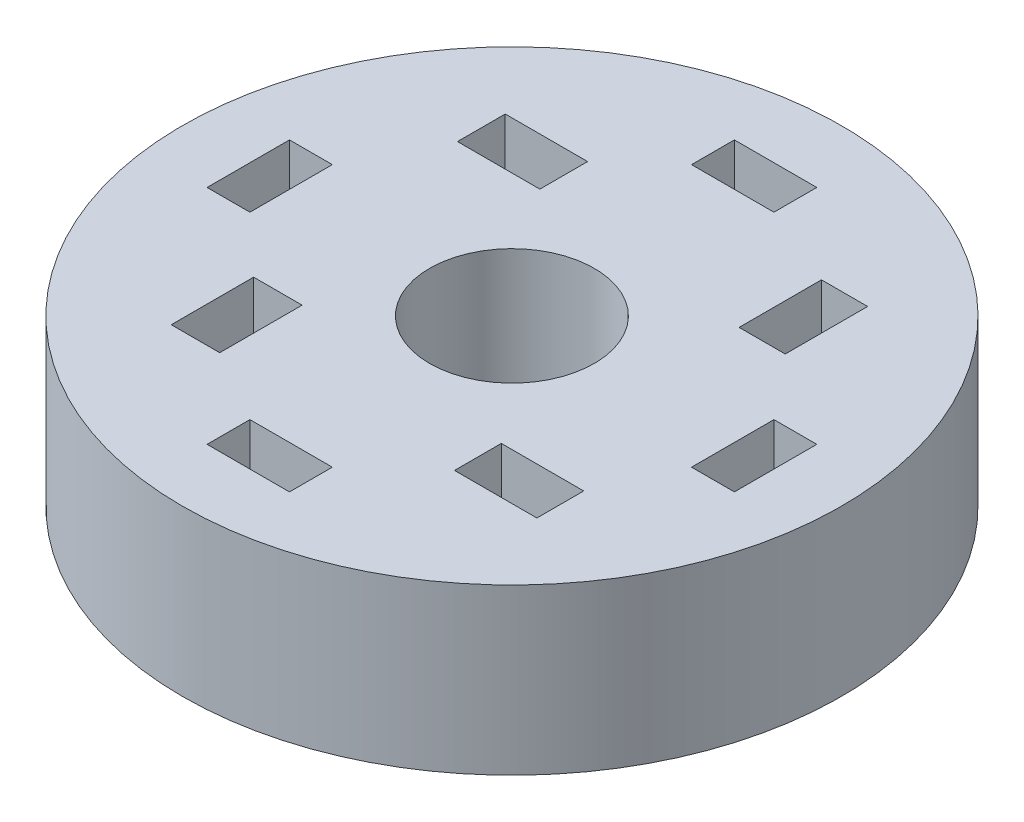
ISO-10303-21;
HEADER;
FILE_DESCRIPTION(('STEP AP214'),'2;1');
FILE_NAME('part.step','',(''),(''),'','','');
FILE_SCHEMA(('AUTOMOTIVE_DESIGN { 1 0 10303 214 1 1 1 1 }'));
ENDSEC;
DATA;
#1=APPLICATION_CONTEXT('core data for automotive mechanical design processes');
#2=APPLICATION_PROTOCOL_DEFINITION('international standard','automotive_design',2000,#1);
#3=PRODUCT_CONTEXT('',#1,'mechanical');
#4=PRODUCT('Part','Part','',(#3));
#5=PRODUCT_RELATED_PRODUCT_CATEGORY('part','',(#4));
#6=PRODUCT_DEFINITION_FORMATION('','',#4);
#7=PRODUCT_DEFINITION_CONTEXT('part definition',#1,'design');
#8=PRODUCT_DEFINITION('design','',#6,#7);
#9=PRODUCT_DEFINITION_SHAPE('','',#8);
#10=(LENGTH_UNIT() NAMED_UNIT(*) SI_UNIT(.MILLI.,.METRE.));
#11=(NAMED_UNIT(*) PLANE_ANGLE_UNIT() SI_UNIT($,.RADIAN.));
#12=(NAMED_UNIT(*) SI_UNIT($,.STERADIAN.) SOLID_ANGLE_UNIT());
#13=UNCERTAINTY_MEASURE_WITH_UNIT(LENGTH_MEASURE(1.E-05),#10,'distance_accuracy_value','');
#14=(GEOMETRIC_REPRESENTATION_CONTEXT(3) GLOBAL_UNCERTAINTY_ASSIGNED_CONTEXT((#13)) GLOBAL_UNIT_ASSIGNED_CONTEXT((#10,
#11,#12)) REPRESENTATION_CONTEXT('',''));
#15=CARTESIAN_POINT('',(0.,0.,0.));
#16=DIRECTION('',(0.,0.,1.));
#17=DIRECTION('',(1.,0.,0.));
#18=AXIS2_PLACEMENT_3D('',#15,#16,#17);
#19=CARTESIAN_POINT('',(-2.5,10.,0.));
#20=DIRECTION('',(1.,0.,0.));
#21=DIRECTION('',(0.,0.,-1.));
#22=AXIS2_PLACEMENT_3D('',#19,#20,#21);
#23=PLANE('',#22);
#24=DIRECTION('',(0.,0.,1.));
#25=VECTOR('',#24,1.);
#26=CARTESIAN_POINT('',(-2.5,0.,0.));
#27=LINE('',#26,#25);
#28=CARTESIAN_POINT('',(-2.5,0.,-16.));
#29=VERTEX_POINT('',#28);
#30=CARTESIAN_POINT('',(-2.5,0.,-13.4));
#31=VERTEX_POINT('',#30);
#32=EDGE_CURVE('E391',#29,#31,#27,.T.);
#33=ORIENTED_EDGE('',*,*,#32,.F.);
#34=DIRECTION('',(0.,-1.,0.));
#35=VECTOR('',#34,1.);
#36=CARTESIAN_POINT('',(-2.5,10.,-16.));
#37=LINE('',#36,#35);
#38=CARTESIAN_POINT('',(-2.5,10.,-16.));
#39=VERTEX_POINT('',#38);
#40=EDGE_CURVE('E12',#39,#29,#37,.T.);
#41=ORIENTED_EDGE('',*,*,#40,.F.);
#42=DIRECTION('',(0.,0.,1.));
#43=VECTOR('',#42,1.);
#44=CARTESIAN_POINT('',(-2.5,10.,0.));
#45=LINE('',#44,#43);
#46=CARTESIAN_POINT('',(-2.5,10.,-13.4));
#47=VERTEX_POINT('',#46);
#48=EDGE_CURVE('E281',#39,#47,#45,.T.);
#49=ORIENTED_EDGE('',*,*,#48,.T.);
#50=DIRECTION('',(0.,-1.,0.));
#51=VECTOR('',#50,1.);
#52=CARTESIAN_POINT('',(-2.5,10.,-13.4));
#53=LINE('',#52,#51);
#54=EDGE_CURVE('E168',#47,#31,#53,.T.);
#55=ORIENTED_EDGE('',*,*,#54,.T.);
#56=EDGE_LOOP('',(#33,#41,#49,#55));
#57=FACE_BOUND('',#56,.T.);
#58=ADVANCED_FACE('F42',(#57),#23,.T.);
#59=CARTESIAN_POINT('',(0.,10.,-16.));
#60=DIRECTION('',(0.,0.,1.));
#61=DIRECTION('',(1.,0.,0.));
#62=AXIS2_PLACEMENT_3D('',#59,#60,#61);
#63=PLANE('',#62);
#64=DIRECTION('',(-1.,0.,0.));
#65=VECTOR('',#64,1.);
#66=CARTESIAN_POINT('',(0.,0.,-16.));
#67=LINE('',#66,#65);
#68=CARTESIAN_POINT('',(2.5,0.,-16.));
#69=VERTEX_POINT('',#68);
#70=EDGE_CURVE('E269',#69,#29,#67,.T.);
#71=ORIENTED_EDGE('',*,*,#70,.F.);
#72=DIRECTION('',(0.,-1.,0.));
#73=VECTOR('',#72,1.);
#74=CARTESIAN_POINT('',(2.5,10.,-16.));
#75=LINE('',#74,#73);
#76=CARTESIAN_POINT('',(2.5,10.,-16.));
#77=VERTEX_POINT('',#76);
#78=EDGE_CURVE('E52',#77,#69,#75,.T.);
#79=ORIENTED_EDGE('',*,*,#78,.F.);
#80=DIRECTION('',(-1.,0.,0.));
#81=VECTOR('',#80,1.);
#82=CARTESIAN_POINT('',(0.,10.,-16.));
#83=LINE('',#82,#81);
#84=EDGE_CURVE('E267',#77,#39,#83,.T.);
#85=ORIENTED_EDGE('',*,*,#84,.T.);
#86=ORIENTED_EDGE('',*,*,#40,.T.);
#87=EDGE_LOOP('',(#71,#79,#85,#86));
#88=FACE_BOUND('',#87,.T.);
#89=ADVANCED_FACE('F265',(#88),#63,.T.);
#90=CARTESIAN_POINT('',(2.5,10.,0.));
#91=DIRECTION('',(1.,0.,0.));
#92=DIRECTION('',(0.,0.,-1.));
#93=AXIS2_PLACEMENT_3D('',#90,#91,#92);
#94=PLANE('',#93);
#95=DIRECTION('',(0.,0.,1.));
#96=VECTOR('',#95,1.);
#97=CARTESIAN_POINT('',(2.5,0.,0.));
#98=LINE('',#97,#96);
#99=CARTESIAN_POINT('',(2.5,0.,-13.4));
#100=VERTEX_POINT('',#99);
#101=EDGE_CURVE('E394',#69,#100,#98,.T.);
#102=ORIENTED_EDGE('',*,*,#101,.T.);
#103=DIRECTION('',(0.,-1.,0.));
#104=VECTOR('',#103,1.);
#105=CARTESIAN_POINT('',(2.5,10.,-13.4));
#106=LINE('',#105,#104);
#107=CARTESIAN_POINT('',(2.5,10.,-13.4));
#108=VERTEX_POINT('',#107);
#109=EDGE_CURVE('E272',#108,#100,#106,.T.);
#110=ORIENTED_EDGE('',*,*,#109,.F.);
#111=DIRECTION('',(0.,0.,1.));
#112=VECTOR('',#111,1.);
#113=CARTESIAN_POINT('',(2.5,10.,0.));
#114=LINE('',#113,#112);
#115=EDGE_CURVE('E275',#77,#108,#114,.T.);
#116=ORIENTED_EDGE('',*,*,#115,.F.);
#117=ORIENTED_EDGE('',*,*,#78,.T.);
#118=EDGE_LOOP('',(#102,#110,#116,#117));
#119=FACE_BOUND('',#118,.T.);
#120=ADVANCED_FACE('F276',(#119),#94,.F.);
#121=CARTESIAN_POINT('',(16.,10.,0.));
#122=DIRECTION('',(-1.,0.,0.));
#123=DIRECTION('',(0.,0.,1.));
#124=AXIS2_PLACEMENT_3D('',#121,#122,#123);
#125=PLANE('',#124);
#126=DIRECTION('',(0.,0.,-1.));
#127=VECTOR('',#126,1.);
#128=CARTESIAN_POINT('',(16.,0.,0.));
#129=LINE('',#128,#127);
#130=CARTESIAN_POINT('',(16.,0.,2.5));
#131=VERTEX_POINT('',#130);
#132=CARTESIAN_POINT('',(16.,0.,-2.5));
#133=VERTEX_POINT('',#132);
#134=EDGE_CURVE('E379',#131,#133,#129,.T.);
#135=ORIENTED_EDGE('',*,*,#134,.F.);
#136=DIRECTION('',(0.,-1.,0.));
#137=VECTOR('',#136,1.);
#138=CARTESIAN_POINT('',(16.,10.,2.5));
#139=LINE('',#138,#137);
#140=CARTESIAN_POINT('',(16.,10.,2.5));
#141=VERTEX_POINT('',#140);
#142=EDGE_CURVE('E402',#141,#131,#139,.T.);
#143=ORIENTED_EDGE('',*,*,#142,.F.);
#144=DIRECTION('',(0.,0.,-1.));
#145=VECTOR('',#144,1.);
#146=CARTESIAN_POINT('',(16.,10.,0.));
#147=LINE('',#146,#145);
#148=CARTESIAN_POINT('',(16.,10.,-2.5));
#149=VERTEX_POINT('',#148);
#150=EDGE_CURVE('E861',#141,#149,#147,.T.);
#151=ORIENTED_EDGE('',*,*,#150,.T.);
#152=DIRECTION('',(0.,-1.,0.));
#153=VECTOR('',#152,1.);
#154=CARTESIAN_POINT('',(16.,10.,-2.5));
#155=LINE('',#154,#153);
#156=EDGE_CURVE('E404',#149,#133,#155,.T.);
#157=ORIENTED_EDGE('',*,*,#156,.T.);
#158=EDGE_LOOP('',(#135,#143,#151,#157));
#159=FACE_BOUND('',#158,.T.);
#160=ADVANCED_FACE('F512',(#159),#125,.T.);
#161=CARTESIAN_POINT('',(0.,10.,2.5));
#162=DIRECTION('',(0.,0.,-1.));
#163=DIRECTION('',(-1.,0.,0.));
#164=AXIS2_PLACEMENT_3D('',#161,#162,#163);
#165=PLANE('',#164);
#166=DIRECTION('',(1.,0.,0.));
#167=VECTOR('',#166,1.);
#168=CARTESIAN_POINT('',(0.,0.,2.5));
#169=LINE('',#168,#167);
#170=CARTESIAN_POINT('',(13.4,0.,2.5));
#171=VERTEX_POINT('',#170);
#172=EDGE_CURVE('E382',#171,#131,#169,.T.);
#173=ORIENTED_EDGE('',*,*,#172,.F.);
#174=DIRECTION('',(0.,-1.,0.));
#175=VECTOR('',#174,1.);
#176=CARTESIAN_POINT('',(13.4,10.,2.5));
#177=LINE('',#176,#175);
#178=CARTESIAN_POINT('',(13.4,10.,2.5));
#179=VERTEX_POINT('',#178);
#180=EDGE_CURVE('E410',#179,#171,#177,.T.);
#181=ORIENTED_EDGE('',*,*,#180,.F.);
#182=DIRECTION('',(1.,0.,0.));
#183=VECTOR('',#182,1.);
#184=CARTESIAN_POINT('',(0.,10.,2.5));
#185=LINE('',#184,#183);
#186=EDGE_CURVE('E864',#179,#141,#185,.T.);
#187=ORIENTED_EDGE('',*,*,#186,.T.);
#188=ORIENTED_EDGE('',*,*,#142,.T.);
#189=EDGE_LOOP('',(#173,#181,#187,#188));
#190=FACE_BOUND('',#189,.T.);
#191=ADVANCED_FACE('F508',(#190),#165,.T.);
#192=CARTESIAN_POINT('',(13.4,10.,0.));
#193=DIRECTION('',(-1.,0.,0.));
#194=DIRECTION('',(0.,0.,1.));
#195=AXIS2_PLACEMENT_3D('',#192,#193,#194);
#196=PLANE('',#195);
#197=DIRECTION('',(0.,0.,-1.));
#198=VECTOR('',#197,1.);
#199=CARTESIAN_POINT('',(13.4,0.,0.));
#200=LINE('',#199,#198);
#201=CARTESIAN_POINT('',(13.4,0.,-2.5));
#202=VERTEX_POINT('',#201);
#203=EDGE_CURVE('E385',#171,#202,#200,.T.);
#204=ORIENTED_EDGE('',*,*,#203,.T.);
#205=DIRECTION('',(0.,-1.,0.));
#206=VECTOR('',#205,1.);
#207=CARTESIAN_POINT('',(13.4,10.,-2.5));
#208=LINE('',#207,#206);
#209=CARTESIAN_POINT('',(13.4,10.,-2.5));
#210=VERTEX_POINT('',#209);
#211=EDGE_CURVE('E406',#210,#202,#208,.T.);
#212=ORIENTED_EDGE('',*,*,#211,.F.);
#213=DIRECTION('',(0.,0.,-1.));
#214=VECTOR('',#213,1.);
#215=CARTESIAN_POINT('',(13.4,10.,0.));
#216=LINE('',#215,#214);
#217=EDGE_CURVE('E873',#179,#210,#216,.T.);
#218=ORIENTED_EDGE('',*,*,#217,.F.);
#219=ORIENTED_EDGE('',*,*,#180,.T.);
#220=EDGE_LOOP('',(#204,#212,#218,#219));
#221=FACE_BOUND('',#220,.T.);
#222=ADVANCED_FACE('F504',(#221),#196,.F.);
#223=CARTESIAN_POINT('',(-16.,10.,0.));
#224=DIRECTION('',(1.,0.,0.));
#225=DIRECTION('',(0.,0.,-1.));
#226=AXIS2_PLACEMENT_3D('',#223,#224,#225);
#227=PLANE('',#226);
#228=DIRECTION('',(0.,0.,1.));
#229=VECTOR('',#228,1.);
#230=CARTESIAN_POINT('',(-16.,0.,0.));
#231=LINE('',#230,#229);
#232=CARTESIAN_POINT('',(-16.,0.,-2.5));
#233=VERTEX_POINT('',#232);
#234=CARTESIAN_POINT('',(-16.,0.,2.5));
#235=VERTEX_POINT('',#234);
#236=EDGE_CURVE('E367',#233,#235,#231,.T.);
#237=ORIENTED_EDGE('',*,*,#236,.F.);
#238=DIRECTION('',(0.,-1.,0.));
#239=VECTOR('',#238,1.);
#240=CARTESIAN_POINT('',(-16.,10.,-2.5));
#241=LINE('',#240,#239);
#242=CARTESIAN_POINT('',(-16.,10.,-2.5));
#243=VERTEX_POINT('',#242);
#244=EDGE_CURVE('E407',#243,#233,#241,.T.);
#245=ORIENTED_EDGE('',*,*,#244,.F.);
#246=DIRECTION('',(0.,0.,1.));
#247=VECTOR('',#246,1.);
#248=CARTESIAN_POINT('',(-16.,10.,0.));
#249=LINE('',#248,#247);
#250=CARTESIAN_POINT('',(-16.,10.,2.5));
#251=VERTEX_POINT('',#250);
#252=EDGE_CURVE('E856',#243,#251,#249,.T.);
#253=ORIENTED_EDGE('',*,*,#252,.T.);
#254=DIRECTION('',(0.,-1.,0.));
#255=VECTOR('',#254,1.);
#256=CARTESIAN_POINT('',(-16.,10.,2.5));
#257=LINE('',#256,#255);
#258=EDGE_CURVE('E413',#251,#235,#257,.T.);
#259=ORIENTED_EDGE('',*,*,#258,.T.);
#260=EDGE_LOOP('',(#237,#245,#253,#259));
#261=FACE_BOUND('',#260,.T.);
#262=ADVANCED_FACE('F507',(#261),#227,.T.);
#263=CARTESIAN_POINT('',(0.,10.,-2.5));
#264=DIRECTION('',(0.,0.,1.));
#265=DIRECTION('',(1.,0.,0.));
#266=AXIS2_PLACEMENT_3D('',#263,#264,#265);
#267=PLANE('',#266);
#268=DIRECTION('',(-1.,0.,0.));
#269=VECTOR('',#268,1.);
#270=CARTESIAN_POINT('',(0.,0.,-2.5));
#271=LINE('',#270,#269);
#272=CARTESIAN_POINT('',(-13.4,0.,-2.5));
#273=VERTEX_POINT('',#272);
#274=EDGE_CURVE('E370',#273,#233,#271,.T.);
#275=ORIENTED_EDGE('',*,*,#274,.F.);
#276=DIRECTION('',(0.,-1.,0.));
#277=VECTOR('',#276,1.);
#278=CARTESIAN_POINT('',(-13.4,10.,-2.5));
#279=LINE('',#278,#277);
#280=CARTESIAN_POINT('',(-13.4,10.,-2.5));
#281=VERTEX_POINT('',#280);
#282=EDGE_CURVE('E419',#281,#273,#279,.T.);
#283=ORIENTED_EDGE('',*,*,#282,.F.);
#284=DIRECTION('',(-1.,0.,0.));
#285=VECTOR('',#284,1.);
#286=CARTESIAN_POINT('',(0.,10.,-2.5));
#287=LINE('',#286,#285);
#288=EDGE_CURVE('E897',#281,#243,#287,.T.);
#289=ORIENTED_EDGE('',*,*,#288,.T.);
#290=ORIENTED_EDGE('',*,*,#244,.T.);
#291=EDGE_LOOP('',(#275,#283,#289,#290));
#292=FACE_BOUND('',#291,.T.);
#293=ADVANCED_FACE('F525',(#292),#267,.T.);
#294=CARTESIAN_POINT('',(-13.4,10.,0.));
#295=DIRECTION('',(1.,0.,0.));
#296=DIRECTION('',(0.,0.,-1.));
#297=AXIS2_PLACEMENT_3D('',#294,#295,#296);
#298=PLANE('',#297);
#299=DIRECTION('',(0.,0.,1.));
#300=VECTOR('',#299,1.);
#301=CARTESIAN_POINT('',(-13.4,0.,0.));
#302=LINE('',#301,#300);
#303=CARTESIAN_POINT('',(-13.4,0.,2.5));
#304=VERTEX_POINT('',#303);
#305=EDGE_CURVE('E373',#273,#304,#302,.T.);
#306=ORIENTED_EDGE('',*,*,#305,.T.);
#307=DIRECTION('',(0.,-1.,0.));
#308=VECTOR('',#307,1.);
#309=CARTESIAN_POINT('',(-13.4,10.,2.5));
#310=LINE('',#309,#308);
#311=CARTESIAN_POINT('',(-13.4,10.,2.5));
#312=VERTEX_POINT('',#311);
#313=EDGE_CURVE('E415',#312,#304,#310,.T.);
#314=ORIENTED_EDGE('',*,*,#313,.F.);
#315=DIRECTION('',(0.,0.,1.));
#316=VECTOR('',#315,1.);
#317=CARTESIAN_POINT('',(-13.4,10.,0.));
#318=LINE('',#317,#316);
#319=EDGE_CURVE('E892',#281,#312,#318,.T.);
#320=ORIENTED_EDGE('',*,*,#319,.F.);
#321=ORIENTED_EDGE('',*,*,#282,.T.);
#322=EDGE_LOOP('',(#306,#314,#320,#321));
#323=FACE_BOUND('',#322,.T.);
#324=ADVANCED_FACE('F521',(#323),#298,.F.);
#325=CARTESIAN_POINT('',(-2.5,10.,0.));
#326=DIRECTION('',(1.,0.,0.));
#327=DIRECTION('',(0.,0.,-1.));
#328=AXIS2_PLACEMENT_3D('',#325,#326,#327);
#329=PLANE('',#328);
#330=DIRECTION('',(0.,0.,1.));
#331=VECTOR('',#330,1.);
#332=CARTESIAN_POINT('',(-2.5,0.,0.));
#333=LINE('',#332,#331);
#334=CARTESIAN_POINT('',(-2.5,0.,13.4));
#335=VERTEX_POINT('',#334);
#336=CARTESIAN_POINT('',(-2.5,0.,16.));
#337=VERTEX_POINT('',#336);
#338=EDGE_CURVE('E355',#335,#337,#333,.T.);
#339=ORIENTED_EDGE('',*,*,#338,.F.);
#340=DIRECTION('',(0.,-1.,0.));
#341=VECTOR('',#340,1.);
#342=CARTESIAN_POINT('',(-2.5,10.,13.4));
#343=LINE('',#342,#341);
#344=CARTESIAN_POINT('',(-2.5,10.,13.4));
#345=VERTEX_POINT('',#344);
#346=EDGE_CURVE('E416',#345,#335,#343,.T.);
#347=ORIENTED_EDGE('',*,*,#346,.F.);
#348=DIRECTION('',(0.,0.,1.));
#349=VECTOR('',#348,1.);
#350=CARTESIAN_POINT('',(-2.5,10.,0.));
#351=LINE('',#350,#349);
#352=CARTESIAN_POINT('',(-2.5,10.,16.));
#353=VERTEX_POINT('',#352);
#354=EDGE_CURVE('E850',#345,#353,#351,.T.);
#355=ORIENTED_EDGE('',*,*,#354,.T.);
#356=DIRECTION('',(0.,-1.,0.));
#357=VECTOR('',#356,1.);
#358=CARTESIAN_POINT('',(-2.5,10.,16.));
#359=LINE('',#358,#357);
#360=EDGE_CURVE('E422',#353,#337,#359,.T.);
#361=ORIENTED_EDGE('',*,*,#360,.T.);
#362=EDGE_LOOP('',(#339,#347,#355,#361));
#363=FACE_BOUND('',#362,.T.);
#364=ADVANCED_FACE('F524',(#363),#329,.T.);
#365=CARTESIAN_POINT('',(0.,10.,13.4));
#366=DIRECTION('',(0.,0.,1.));
#367=DIRECTION('',(1.,0.,0.));
#368=AXIS2_PLACEMENT_3D('',#365,#366,#367);
#369=PLANE('',#368);
#370=DIRECTION('',(-1.,0.,0.));
#371=VECTOR('',#370,1.);
#372=CARTESIAN_POINT('',(0.,0.,13.4));
#373=LINE('',#372,#371);
#374=CARTESIAN_POINT('',(2.5,0.,13.4));
#375=VERTEX_POINT('',#374);
#376=EDGE_CURVE('E358',#375,#335,#373,.T.);
#377=ORIENTED_EDGE('',*,*,#376,.F.);
#378=DIRECTION('',(0.,-1.,0.));
#379=VECTOR('',#378,1.);
#380=CARTESIAN_POINT('',(2.5,10.,13.4));
#381=LINE('',#380,#379);
#382=CARTESIAN_POINT('',(2.5,10.,13.4));
#383=VERTEX_POINT('',#382);
#384=EDGE_CURVE('E428',#383,#375,#381,.T.);
#385=ORIENTED_EDGE('',*,*,#384,.F.);
#386=DIRECTION('',(-1.,0.,0.));
#387=VECTOR('',#386,1.);
#388=CARTESIAN_POINT('',(0.,10.,13.4));
#389=LINE('',#388,#387);
#390=EDGE_CURVE('E916',#383,#345,#389,.T.);
#391=ORIENTED_EDGE('',*,*,#390,.T.);
#392=ORIENTED_EDGE('',*,*,#346,.T.);
#393=EDGE_LOOP('',(#377,#385,#391,#392));
#394=FACE_BOUND('',#393,.T.);
#395=ADVANCED_FACE('F541',(#394),#369,.T.);
#396=CARTESIAN_POINT('',(2.5,10.,0.));
#397=DIRECTION('',(1.,0.,0.));
#398=DIRECTION('',(0.,0.,-1.));
#399=AXIS2_PLACEMENT_3D('',#396,#397,#398);
#400=PLANE('',#399);
#401=DIRECTION('',(0.,0.,1.));
#402=VECTOR('',#401,1.);
#403=CARTESIAN_POINT('',(2.5,0.,0.));
#404=LINE('',#403,#402);
#405=CARTESIAN_POINT('',(2.5,0.,16.));
#406=VERTEX_POINT('',#405);
#407=EDGE_CURVE('E361',#375,#406,#404,.T.);
#408=ORIENTED_EDGE('',*,*,#407,.T.);
#409=DIRECTION('',(0.,-1.,0.));
#410=VECTOR('',#409,1.);
#411=CARTESIAN_POINT('',(2.5,10.,16.));
#412=LINE('',#411,#410);
#413=CARTESIAN_POINT('',(2.5,10.,16.));
#414=VERTEX_POINT('',#413);
#415=EDGE_CURVE('E424',#414,#406,#412,.T.);
#416=ORIENTED_EDGE('',*,*,#415,.F.);
#417=DIRECTION('',(0.,0.,1.));
#418=VECTOR('',#417,1.);
#419=CARTESIAN_POINT('',(2.5,10.,0.));
#420=LINE('',#419,#418);
#421=EDGE_CURVE('E911',#383,#414,#420,.T.);
#422=ORIENTED_EDGE('',*,*,#421,.F.);
#423=ORIENTED_EDGE('',*,*,#384,.T.);
#424=EDGE_LOOP('',(#408,#416,#422,#423));
#425=FACE_BOUND('',#424,.T.);
#426=ADVANCED_FACE('F537',(#425),#400,.F.);
#427=CARTESIAN_POINT('',(0.,10.,-11.2886822630475));
#428=DIRECTION('',(0.,0.,-1.));
#429=DIRECTION('',(-1.,0.,0.));
#430=AXIS2_PLACEMENT_3D('',#427,#428,#429);
#431=PLANE('',#430);
#432=DIRECTION('',(1.,0.,0.));
#433=VECTOR('',#432,1.);
#434=CARTESIAN_POINT('',(0.,0.,-11.2886822630475));
#435=LINE('',#434,#433);
#436=CARTESIAN_POINT('',(7.49640581322462,0.,-11.2886822630475));
#437=VERTEX_POINT('',#436);
#438=CARTESIAN_POINT('',(10.2964058132246,0.,-11.2886822630475));
#439=VERTEX_POINT('',#438);
#440=EDGE_CURVE('E343',#437,#439,#435,.T.);
#441=ORIENTED_EDGE('',*,*,#440,.T.);
#442=DIRECTION('',(0.,-1.,0.));
#443=VECTOR('',#442,1.);
#444=CARTESIAN_POINT('',(10.2964058132246,10.,-11.2886822630475));
#445=LINE('',#444,#443);
#446=CARTESIAN_POINT('',(10.2964058132246,10.,-11.2886822630475));
#447=VERTEX_POINT('',#446);
#448=EDGE_CURVE('E425',#447,#439,#445,.T.);
#449=ORIENTED_EDGE('',*,*,#448,.F.);
#450=DIRECTION('',(1.,0.,0.));
#451=VECTOR('',#450,1.);
#452=CARTESIAN_POINT('',(0.,10.,-11.2886822630475));
#453=LINE('',#452,#451);
#454=CARTESIAN_POINT('',(7.49640581322462,10.,-11.2886822630475));
#455=VERTEX_POINT('',#454);
#456=EDGE_CURVE('E844',#455,#447,#453,.T.);
#457=ORIENTED_EDGE('',*,*,#456,.F.);
#458=DIRECTION('',(0.,-1.,0.));
#459=VECTOR('',#458,1.);
#460=CARTESIAN_POINT('',(7.49640581322462,10.,-11.2886822630475));
#461=LINE('',#460,#459);
#462=EDGE_CURVE('E431',#455,#437,#461,.T.);
#463=ORIENTED_EDGE('',*,*,#462,.T.);
#464=EDGE_LOOP('',(#441,#449,#457,#463));
#465=FACE_BOUND('',#464,.T.);
#466=ADVANCED_FACE('F540',(#465),#431,.F.);
#467=CARTESIAN_POINT('',(10.2964058132246,10.,0.));
#468=DIRECTION('',(1.,0.,0.));
#469=DIRECTION('',(0.,0.,-1.));
#470=AXIS2_PLACEMENT_3D('',#467,#468,#469);
#471=PLANE('',#470);
#472=DIRECTION('',(0.,0.,1.));
#473=VECTOR('',#472,1.);
#474=CARTESIAN_POINT('',(10.2964058132246,0.,0.));
#475=LINE('',#474,#473);
#476=CARTESIAN_POINT('',(10.2964058132246,0.,-6.28868226304745));
#477=VERTEX_POINT('',#476);
#478=EDGE_CURVE('E346',#439,#477,#475,.T.);
#479=ORIENTED_EDGE('',*,*,#478,.T.);
#480=DIRECTION('',(0.,-1.,0.));
#481=VECTOR('',#480,1.);
#482=CARTESIAN_POINT('',(10.2964058132246,10.,-6.28868226304745));
#483=LINE('',#482,#481);
#484=CARTESIAN_POINT('',(10.2964058132246,10.,-6.28868226304745));
#485=VERTEX_POINT('',#484);
#486=EDGE_CURVE('E436',#485,#477,#483,.T.);
#487=ORIENTED_EDGE('',*,*,#486,.F.);
#488=DIRECTION('',(0.,0.,1.));
#489=VECTOR('',#488,1.);
#490=CARTESIAN_POINT('',(10.2964058132246,10.,0.));
#491=LINE('',#490,#489);
#492=EDGE_CURVE('E936',#447,#485,#491,.T.);
#493=ORIENTED_EDGE('',*,*,#492,.F.);
#494=ORIENTED_EDGE('',*,*,#448,.T.);
#495=EDGE_LOOP('',(#479,#487,#493,#494));
#496=FACE_BOUND('',#495,.T.);
#497=ADVANCED_FACE('F557',(#496),#471,.F.);
#498=CARTESIAN_POINT('',(0.,10.,-6.28868226304745));
#499=DIRECTION('',(0.,0.,-1.));
#500=DIRECTION('',(-1.,0.,0.));
#501=AXIS2_PLACEMENT_3D('',#498,#499,#500);
#502=PLANE('',#501);
#503=DIRECTION('',(1.,0.,0.));
#504=VECTOR('',#503,1.);
#505=CARTESIAN_POINT('',(0.,0.,-6.28868226304745));
#506=LINE('',#505,#504);
#507=CARTESIAN_POINT('',(7.49640581322462,0.,-6.28868226304745));
#508=VERTEX_POINT('',#507);
#509=EDGE_CURVE('E349',#508,#477,#506,.T.);
#510=ORIENTED_EDGE('',*,*,#509,.F.);
#511=DIRECTION('',(0.,-1.,0.));
#512=VECTOR('',#511,1.);
#513=CARTESIAN_POINT('',(7.49640581322462,10.,-6.28868226304745));
#514=LINE('',#513,#512);
#515=CARTESIAN_POINT('',(7.49640581322462,10.,-6.28868226304745));
#516=VERTEX_POINT('',#515);
#517=EDGE_CURVE('E433',#516,#508,#514,.T.);
#518=ORIENTED_EDGE('',*,*,#517,.F.);
#519=DIRECTION('',(1.,0.,0.));
#520=VECTOR('',#519,1.);
#521=CARTESIAN_POINT('',(0.,10.,-6.28868226304745));
#522=LINE('',#521,#520);
#523=EDGE_CURVE('E931',#516,#485,#522,.T.);
#524=ORIENTED_EDGE('',*,*,#523,.T.);
#525=ORIENTED_EDGE('',*,*,#486,.T.);
#526=EDGE_LOOP('',(#510,#518,#524,#525));
#527=FACE_BOUND('',#526,.T.);
#528=ADVANCED_FACE('F553',(#527),#502,.T.);
#529=CARTESIAN_POINT('',(0.,10.,5.80117142327372));
#530=DIRECTION('',(0.,0.,-1.));
#531=DIRECTION('',(-1.,0.,0.));
#532=AXIS2_PLACEMENT_3D('',#529,#530,#531);
#533=PLANE('',#532);
#534=DIRECTION('',(1.,0.,0.));
#535=VECTOR('',#534,1.);
#536=CARTESIAN_POINT('',(0.,0.,5.80117142327372));
#537=LINE('',#536,#535);
#538=CARTESIAN_POINT('',(-9.8737214238357,0.,5.80117142327372));
#539=VERTEX_POINT('',#538);
#540=CARTESIAN_POINT('',(-6.9321176078234,0.,5.80117142327372));
#541=VERTEX_POINT('',#540);
#542=EDGE_CURVE('E331',#539,#541,#537,.T.);
#543=ORIENTED_EDGE('',*,*,#542,.T.);
#544=DIRECTION('',(0.,-1.,0.));
#545=VECTOR('',#544,1.);
#546=CARTESIAN_POINT('',(-6.9321176078234,10.,5.80117142327372));
#547=LINE('',#546,#545);
#548=CARTESIAN_POINT('',(-6.9321176078234,10.,5.80117142327372));
#549=VERTEX_POINT('',#548);
#550=EDGE_CURVE('E434',#549,#541,#547,.T.);
#551=ORIENTED_EDGE('',*,*,#550,.F.);
#552=DIRECTION('',(1.,0.,0.));
#553=VECTOR('',#552,1.);
#554=CARTESIAN_POINT('',(0.,10.,5.80117142327372));
#555=LINE('',#554,#553);
#556=CARTESIAN_POINT('',(-9.8737214238357,10.,5.80117142327372));
#557=VERTEX_POINT('',#556);
#558=EDGE_CURVE('E838',#557,#549,#555,.T.);
#559=ORIENTED_EDGE('',*,*,#558,.F.);
#560=DIRECTION('',(0.,-1.,0.));
#561=VECTOR('',#560,1.);
#562=CARTESIAN_POINT('',(-9.8737214238357,10.,5.80117142327372));
#563=LINE('',#562,#561);
#564=EDGE_CURVE('E440',#557,#539,#563,.T.);
#565=ORIENTED_EDGE('',*,*,#564,.T.);
#566=EDGE_LOOP('',(#543,#551,#559,#565));
#567=FACE_BOUND('',#566,.T.);
#568=ADVANCED_FACE('F556',(#567),#533,.F.);
#569=CARTESIAN_POINT('',(-6.9321176078234,10.,0.));
#570=DIRECTION('',(1.,0.,0.));
#571=DIRECTION('',(0.,0.,-1.));
#572=AXIS2_PLACEMENT_3D('',#569,#570,#571);
#573=PLANE('',#572);
#574=DIRECTION('',(0.,0.,1.));
#575=VECTOR('',#574,1.);
#576=CARTESIAN_POINT('',(-6.9321176078234,0.,0.));
#577=LINE('',#576,#575);
#578=CARTESIAN_POINT('',(-6.9321176078234,0.,10.8011714232737));
#579=VERTEX_POINT('',#578);
#580=EDGE_CURVE('E334',#541,#579,#577,.T.);
#581=ORIENTED_EDGE('',*,*,#580,.T.);
#582=DIRECTION('',(0.,-1.,0.));
#583=VECTOR('',#582,1.);
#584=CARTESIAN_POINT('',(-6.9321176078234,10.,10.8011714232737));
#585=LINE('',#584,#583);
#586=CARTESIAN_POINT('',(-6.9321176078234,10.,10.8011714232737));
#587=VERTEX_POINT('',#586);
#588=EDGE_CURVE('E445',#587,#579,#585,.T.);
#589=ORIENTED_EDGE('',*,*,#588,.F.);
#590=DIRECTION('',(0.,0.,1.));
#591=VECTOR('',#590,1.);
#592=CARTESIAN_POINT('',(-6.9321176078234,10.,0.));
#593=LINE('',#592,#591);
#594=EDGE_CURVE('E956',#549,#587,#593,.T.);
#595=ORIENTED_EDGE('',*,*,#594,.F.);
#596=ORIENTED_EDGE('',*,*,#550,.T.);
#597=EDGE_LOOP('',(#581,#589,#595,#596));
#598=FACE_BOUND('',#597,.T.);
#599=ADVANCED_FACE('F573',(#598),#573,.F.);
#600=CARTESIAN_POINT('',(0.,10.,10.8011714232737));
#601=DIRECTION('',(0.,0.,-1.));
#602=DIRECTION('',(-1.,0.,0.));
#603=AXIS2_PLACEMENT_3D('',#600,#601,#602);
#604=PLANE('',#603);
#605=DIRECTION('',(1.,0.,0.));
#606=VECTOR('',#605,1.);
#607=CARTESIAN_POINT('',(0.,0.,10.8011714232737));
#608=LINE('',#607,#606);
#609=CARTESIAN_POINT('',(-9.8737214238357,0.,10.8011714232737));
#610=VERTEX_POINT('',#609);
#611=EDGE_CURVE('E337',#610,#579,#608,.T.);
#612=ORIENTED_EDGE('',*,*,#611,.F.);
#613=DIRECTION('',(0.,-1.,0.));
#614=VECTOR('',#613,1.);
#615=CARTESIAN_POINT('',(-9.8737214238357,10.,10.8011714232737));
#616=LINE('',#615,#614);
#617=CARTESIAN_POINT('',(-9.8737214238357,10.,10.8011714232737));
#618=VERTEX_POINT('',#617);
#619=EDGE_CURVE('E442',#618,#610,#616,.T.);
#620=ORIENTED_EDGE('',*,*,#619,.F.);
#621=DIRECTION('',(1.,0.,0.));
#622=VECTOR('',#621,1.);
#623=CARTESIAN_POINT('',(0.,10.,10.8011714232737));
#624=LINE('',#623,#622);
#625=EDGE_CURVE('E951',#618,#587,#624,.T.);
#626=ORIENTED_EDGE('',*,*,#625,.T.);
#627=ORIENTED_EDGE('',*,*,#588,.T.);
#628=EDGE_LOOP('',(#612,#620,#626,#627));
#629=FACE_BOUND('',#628,.T.);
#630=ADVANCED_FACE('F569',(#629),#604,.T.);
#631=CARTESIAN_POINT('',(0.,10.,-10.4078054472951));
#632=DIRECTION('',(0.,0.,-1.));
#633=DIRECTION('',(-1.,0.,0.));
#634=AXIS2_PLACEMENT_3D('',#631,#632,#633);
#635=PLANE('',#634);
#636=DIRECTION('',(1.,0.,0.));
#637=VECTOR('',#636,1.);
#638=CARTESIAN_POINT('',(0.,0.,-10.4078054472951));
#639=LINE('',#638,#637);
#640=CARTESIAN_POINT('',(-10.8147002978011,0.,-10.4078054472951));
#641=VERTEX_POINT('',#640);
#642=CARTESIAN_POINT('',(-5.81470029780107,0.,-10.4078054472951));
#643=VERTEX_POINT('',#642);
#644=EDGE_CURVE('E319',#641,#643,#639,.T.);
#645=ORIENTED_EDGE('',*,*,#644,.T.);
#646=DIRECTION('',(0.,-1.,0.));
#647=VECTOR('',#646,1.);
#648=CARTESIAN_POINT('',(-5.81470029780107,10.,-10.4078054472951));
#649=LINE('',#648,#647);
#650=CARTESIAN_POINT('',(-5.81470029780107,10.,-10.4078054472951));
#651=VERTEX_POINT('',#650);
#652=EDGE_CURVE('E443',#651,#643,#649,.T.);
#653=ORIENTED_EDGE('',*,*,#652,.F.);
#654=DIRECTION('',(1.,0.,0.));
#655=VECTOR('',#654,1.);
#656=CARTESIAN_POINT('',(0.,10.,-10.4078054472951));
#657=LINE('',#656,#655);
#658=CARTESIAN_POINT('',(-10.8147002978011,10.,-10.4078054472951));
#659=VERTEX_POINT('',#658);
#660=EDGE_CURVE('E832',#659,#651,#657,.T.);
#661=ORIENTED_EDGE('',*,*,#660,.F.);
#662=DIRECTION('',(0.,-1.,0.));
#663=VECTOR('',#662,1.);
#664=CARTESIAN_POINT('',(-10.8147002978011,10.,-10.4078054472951));
#665=LINE('',#664,#663);
#666=EDGE_CURVE('E449',#659,#641,#665,.T.);
#667=ORIENTED_EDGE('',*,*,#666,.T.);
#668=EDGE_LOOP('',(#645,#653,#661,#667));
#669=FACE_BOUND('',#668,.T.);
#670=ADVANCED_FACE('F572',(#669),#635,.F.);
#671=CARTESIAN_POINT('',(-5.81470029780107,10.,0.));
#672=DIRECTION('',(1.,0.,0.));
#673=DIRECTION('',(0.,0.,-1.));
#674=AXIS2_PLACEMENT_3D('',#671,#672,#673);
#675=PLANE('',#674);
#676=DIRECTION('',(0.,0.,1.));
#677=VECTOR('',#676,1.);
#678=CARTESIAN_POINT('',(-5.81470029780107,0.,0.));
#679=LINE('',#678,#677);
#680=CARTESIAN_POINT('',(-5.81470029780107,0.,-7.50993468775197));
#681=VERTEX_POINT('',#680);
#682=EDGE_CURVE('E322',#643,#681,#679,.T.);
#683=ORIENTED_EDGE('',*,*,#682,.T.);
#684=DIRECTION('',(0.,-1.,0.));
#685=VECTOR('',#684,1.);
#686=CARTESIAN_POINT('',(-5.81470029780107,10.,-7.50993468775197));
#687=LINE('',#686,#685);
#688=CARTESIAN_POINT('',(-5.81470029780107,10.,-7.50993468775197));
#689=VERTEX_POINT('',#688);
#690=EDGE_CURVE('E453',#689,#681,#687,.T.);
#691=ORIENTED_EDGE('',*,*,#690,.F.);
#692=DIRECTION('',(0.,0.,1.));
#693=VECTOR('',#692,1.);
#694=CARTESIAN_POINT('',(-5.81470029780107,10.,0.));
#695=LINE('',#694,#693);
#696=EDGE_CURVE('E976',#651,#689,#695,.T.);
#697=ORIENTED_EDGE('',*,*,#696,.F.);
#698=ORIENTED_EDGE('',*,*,#652,.T.);
#699=EDGE_LOOP('',(#683,#691,#697,#698));
#700=FACE_BOUND('',#699,.T.);
#701=ADVANCED_FACE('F587',(#700),#675,.F.);
#702=CARTESIAN_POINT('',(0.,10.,-7.50993468775197));
#703=DIRECTION('',(0.,0.,-1.));
#704=DIRECTION('',(-1.,0.,0.));
#705=AXIS2_PLACEMENT_3D('',#702,#703,#704);
#706=PLANE('',#705);
#707=DIRECTION('',(1.,0.,0.));
#708=VECTOR('',#707,1.);
#709=CARTESIAN_POINT('',(0.,0.,-7.50993468775197));
#710=LINE('',#709,#708);
#711=CARTESIAN_POINT('',(-10.8147002978011,0.,-7.50993468775197));
#712=VERTEX_POINT('',#711);
#713=EDGE_CURVE('E325',#712,#681,#710,.T.);
#714=ORIENTED_EDGE('',*,*,#713,.F.);
#715=DIRECTION('',(0.,-1.,0.));
#716=VECTOR('',#715,1.);
#717=CARTESIAN_POINT('',(-10.8147002978011,10.,-7.50993468775197));
#718=LINE('',#717,#716);
#719=CARTESIAN_POINT('',(-10.8147002978011,10.,-7.50993468775197));
#720=VERTEX_POINT('',#719);
#721=EDGE_CURVE('E451',#720,#712,#718,.T.);
#722=ORIENTED_EDGE('',*,*,#721,.F.);
#723=DIRECTION('',(1.,0.,0.));
#724=VECTOR('',#723,1.);
#725=CARTESIAN_POINT('',(0.,10.,-7.50993468775197));
#726=LINE('',#725,#724);
#727=EDGE_CURVE('E971',#720,#689,#726,.T.);
#728=ORIENTED_EDGE('',*,*,#727,.T.);
#729=ORIENTED_EDGE('',*,*,#690,.T.);
#730=EDGE_LOOP('',(#714,#722,#728,#729));
#731=FACE_BOUND('',#730,.T.);
#732=ADVANCED_FACE('F584',(#731),#706,.T.);
#733=CARTESIAN_POINT('',(0.,10.,7.02242384797824));
#734=DIRECTION('',(0.,0.,-1.));
#735=DIRECTION('',(-1.,0.,0.));
#736=AXIS2_PLACEMENT_3D('',#733,#734,#735);
#737=PLANE('',#736);
#738=DIRECTION('',(1.,0.,0.));
#739=VECTOR('',#738,1.);
#740=CARTESIAN_POINT('',(0.,0.,7.02242384797824));
#741=LINE('',#740,#739);
#742=CARTESIAN_POINT('',(6.378230893535,0.,7.02242384797824));
#743=VERTEX_POINT('',#742);
#744=CARTESIAN_POINT('',(11.378230893535,0.,7.02242384797824));
#745=VERTEX_POINT('',#744);
#746=EDGE_CURVE('E307',#743,#745,#741,.T.);
#747=ORIENTED_EDGE('',*,*,#746,.T.);
#748=DIRECTION('',(0.,-1.,0.));
#749=VECTOR('',#748,1.);
#750=CARTESIAN_POINT('',(11.378230893535,10.,7.02242384797824));
#751=LINE('',#750,#749);
#752=CARTESIAN_POINT('',(11.378230893535,10.,7.02242384797824));
#753=VERTEX_POINT('',#752);
#754=EDGE_CURVE('E46',#753,#745,#751,.T.);
#755=ORIENTED_EDGE('',*,*,#754,.F.);
#756=DIRECTION('',(1.,0.,0.));
#757=VECTOR('',#756,1.);
#758=CARTESIAN_POINT('',(0.,10.,7.02242384797824));
#759=LINE('',#758,#757);
#760=CARTESIAN_POINT('',(6.378230893535,10.,7.02242384797824));
#761=VERTEX_POINT('',#760);
#762=EDGE_CURVE('E827',#761,#753,#759,.T.);
#763=ORIENTED_EDGE('',*,*,#762,.F.);
#764=DIRECTION('',(0.,-1.,0.));
#765=VECTOR('',#764,1.);
#766=CARTESIAN_POINT('',(6.378230893535,10.,7.02242384797824));
#767=LINE('',#766,#765);
#768=EDGE_CURVE('E303',#761,#743,#767,.T.);
#769=ORIENTED_EDGE('',*,*,#768,.T.);
#770=EDGE_LOOP('',(#747,#755,#763,#769));
#771=FACE_BOUND('',#770,.T.);
#772=ADVANCED_FACE('F468',(#771),#737,.F.);
#773=CARTESIAN_POINT('',(11.378230893535,10.,0.));
#774=DIRECTION('',(1.,0.,0.));
#775=DIRECTION('',(0.,0.,-1.));
#776=AXIS2_PLACEMENT_3D('',#773,#774,#775);
#777=PLANE('',#776);
#778=DIRECTION('',(0.,0.,1.));
#779=VECTOR('',#778,1.);
#780=CARTESIAN_POINT('',(11.378230893535,0.,0.));
#781=LINE('',#780,#779);
#782=CARTESIAN_POINT('',(11.378230893535,0.,9.86395189364812));
#783=VERTEX_POINT('',#782);
#784=EDGE_CURVE('E310',#745,#783,#781,.T.);
#785=ORIENTED_EDGE('',*,*,#784,.T.);
#786=DIRECTION('',(0.,-1.,0.));
#787=VECTOR('',#786,1.);
#788=CARTESIAN_POINT('',(11.378230893535,10.,9.86395189364812));
#789=LINE('',#788,#787);
#790=CARTESIAN_POINT('',(11.378230893535,10.,9.86395189364812));
#791=VERTEX_POINT('',#790);
#792=EDGE_CURVE('E459',#791,#783,#789,.T.);
#793=ORIENTED_EDGE('',*,*,#792,.F.);
#794=DIRECTION('',(0.,0.,1.));
#795=VECTOR('',#794,1.);
#796=CARTESIAN_POINT('',(11.378230893535,10.,0.));
#797=LINE('',#796,#795);
#798=EDGE_CURVE('E176',#753,#791,#797,.T.);
#799=ORIENTED_EDGE('',*,*,#798,.F.);
#800=ORIENTED_EDGE('',*,*,#754,.T.);
#801=EDGE_LOOP('',(#785,#793,#799,#800));
#802=FACE_BOUND('',#801,.T.);
#803=ADVANCED_FACE('F464',(#802),#777,.F.);
#804=CARTESIAN_POINT('',(0.,10.,9.86395189364812));
#805=DIRECTION('',(0.,0.,-1.));
#806=DIRECTION('',(-1.,0.,0.));
#807=AXIS2_PLACEMENT_3D('',#804,#805,#806);
#808=PLANE('',#807);
#809=DIRECTION('',(1.,0.,0.));
#810=VECTOR('',#809,1.);
#811=CARTESIAN_POINT('',(0.,0.,9.86395189364812));
#812=LINE('',#811,#810);
#813=CARTESIAN_POINT('',(6.378230893535,0.,9.86395189364812));
#814=VERTEX_POINT('',#813);
#815=EDGE_CURVE('E313',#814,#783,#812,.T.);
#816=ORIENTED_EDGE('',*,*,#815,.F.);
#817=DIRECTION('',(0.,-1.,0.));
#818=VECTOR('',#817,1.);
#819=CARTESIAN_POINT('',(6.378230893535,10.,9.86395189364812));
#820=LINE('',#819,#818);
#821=CARTESIAN_POINT('',(6.378230893535,10.,9.86395189364812));
#822=VERTEX_POINT('',#821);
#823=EDGE_CURVE('E458',#822,#814,#820,.T.);
#824=ORIENTED_EDGE('',*,*,#823,.F.);
#825=DIRECTION('',(1.,0.,0.));
#826=VECTOR('',#825,1.);
#827=CARTESIAN_POINT('',(0.,10.,9.86395189364812));
#828=LINE('',#827,#826);
#829=EDGE_CURVE('E989',#822,#791,#828,.T.);
#830=ORIENTED_EDGE('',*,*,#829,.T.);
#831=ORIENTED_EDGE('',*,*,#792,.T.);
#832=EDGE_LOOP('',(#816,#824,#830,#831));
#833=FACE_BOUND('',#832,.T.);
#834=ADVANCED_FACE('F479',(#833),#808,.T.);
#835=CARTESIAN_POINT('',(0.,10.,-13.4));
#836=DIRECTION('',(0.,0.,1.));
#837=DIRECTION('',(1.,0.,0.));
#838=AXIS2_PLACEMENT_3D('',#835,#836,#837);
#839=PLANE('',#838);
#840=DIRECTION('',(-1.,0.,0.));
#841=VECTOR('',#840,1.);
#842=CARTESIAN_POINT('',(0.,0.,-13.4));
#843=LINE('',#842,#841);
#844=EDGE_CURVE('E161',#100,#31,#843,.T.);
#845=ORIENTED_EDGE('',*,*,#844,.T.);
#846=ORIENTED_EDGE('',*,*,#54,.F.);
#847=DIRECTION('',(-1.,0.,0.));
#848=VECTOR('',#847,1.);
#849=CARTESIAN_POINT('',(0.,10.,-13.4));
#850=LINE('',#849,#848);
#851=EDGE_CURVE('E61',#108,#47,#850,.T.);
#852=ORIENTED_EDGE('',*,*,#851,.F.);
#853=ORIENTED_EDGE('',*,*,#109,.T.);
#854=EDGE_LOOP('',(#845,#846,#852,#853));
#855=FACE_BOUND('',#854,.T.);
#856=ADVANCED_FACE('F481',(#855),#839,.F.);
#857=CARTESIAN_POINT('',(0.,10.,-2.5));
#858=DIRECTION('',(0.,0.,-1.));
#859=DIRECTION('',(-1.,0.,0.));
#860=AXIS2_PLACEMENT_3D('',#857,#858,#859);
#861=PLANE('',#860);
#862=DIRECTION('',(1.,0.,0.));
#863=VECTOR('',#862,1.);
#864=CARTESIAN_POINT('',(0.,0.,-2.5));
#865=LINE('',#864,#863);
#866=EDGE_CURVE('E388',#202,#133,#865,.T.);
#867=ORIENTED_EDGE('',*,*,#866,.T.);
#868=ORIENTED_EDGE('',*,*,#156,.F.);
#869=DIRECTION('',(1.,0.,0.));
#870=VECTOR('',#869,1.);
#871=CARTESIAN_POINT('',(0.,10.,-2.5));
#872=LINE('',#871,#870);
#873=EDGE_CURVE('E285',#210,#149,#872,.T.);
#874=ORIENTED_EDGE('',*,*,#873,.F.);
#875=ORIENTED_EDGE('',*,*,#211,.T.);
#876=EDGE_LOOP('',(#867,#868,#874,#875));
#877=FACE_BOUND('',#876,.T.);
#878=ADVANCED_FACE('F487',(#877),#861,.F.);
#879=CARTESIAN_POINT('',(0.,10.,2.5));
#880=DIRECTION('',(0.,0.,1.));
#881=DIRECTION('',(1.,0.,0.));
#882=AXIS2_PLACEMENT_3D('',#879,#880,#881);
#883=PLANE('',#882);
#884=DIRECTION('',(-1.,0.,0.));
#885=VECTOR('',#884,1.);
#886=CARTESIAN_POINT('',(0.,0.,2.5));
#887=LINE('',#886,#885);
#888=EDGE_CURVE('E376',#304,#235,#887,.T.);
#889=ORIENTED_EDGE('',*,*,#888,.T.);
#890=ORIENTED_EDGE('',*,*,#258,.F.);
#891=DIRECTION('',(-1.,0.,0.));
#892=VECTOR('',#891,1.);
#893=CARTESIAN_POINT('',(0.,10.,2.5));
#894=LINE('',#893,#892);
#895=EDGE_CURVE('E867',#312,#251,#894,.T.);
#896=ORIENTED_EDGE('',*,*,#895,.F.);
#897=ORIENTED_EDGE('',*,*,#313,.T.);
#898=EDGE_LOOP('',(#889,#890,#896,#897));
#899=FACE_BOUND('',#898,.T.);
#900=ADVANCED_FACE('F502',(#899),#883,.F.);
#901=CARTESIAN_POINT('',(0.,10.,16.));
#902=DIRECTION('',(0.,0.,1.));
#903=DIRECTION('',(1.,0.,0.));
#904=AXIS2_PLACEMENT_3D('',#901,#902,#903);
#905=PLANE('',#904);
#906=DIRECTION('',(-1.,0.,0.));
#907=VECTOR('',#906,1.);
#908=CARTESIAN_POINT('',(0.,0.,16.));
#909=LINE('',#908,#907);
#910=EDGE_CURVE('E364',#406,#337,#909,.T.);
#911=ORIENTED_EDGE('',*,*,#910,.T.);
#912=ORIENTED_EDGE('',*,*,#360,.F.);
#913=DIRECTION('',(-1.,0.,0.));
#914=VECTOR('',#913,1.);
#915=CARTESIAN_POINT('',(0.,10.,16.));
#916=LINE('',#915,#914);
#917=EDGE_CURVE('E908',#414,#353,#916,.T.);
#918=ORIENTED_EDGE('',*,*,#917,.F.);
#919=ORIENTED_EDGE('',*,*,#415,.T.);
#920=EDGE_LOOP('',(#911,#912,#918,#919));
#921=FACE_BOUND('',#920,.T.);
#922=ADVANCED_FACE('F519',(#921),#905,.F.);
#923=CARTESIAN_POINT('',(7.49640581322463,10.,0.));
#924=DIRECTION('',(1.,0.,0.));
#925=DIRECTION('',(0.,0.,-1.));
#926=AXIS2_PLACEMENT_3D('',#923,#924,#925);
#927=PLANE('',#926);
#928=DIRECTION('',(0.,0.,1.));
#929=VECTOR('',#928,1.);
#930=CARTESIAN_POINT('',(7.49640581322463,0.,0.));
#931=LINE('',#930,#929);
#932=EDGE_CURVE('E352',#437,#508,#931,.T.);
#933=ORIENTED_EDGE('',*,*,#932,.F.);
#934=ORIENTED_EDGE('',*,*,#462,.F.);
#935=DIRECTION('',(0.,0.,1.));
#936=VECTOR('',#935,1.);
#937=CARTESIAN_POINT('',(7.49640581322463,10.,0.));
#938=LINE('',#937,#936);
#939=EDGE_CURVE('E927',#455,#516,#938,.T.);
#940=ORIENTED_EDGE('',*,*,#939,.T.);
#941=ORIENTED_EDGE('',*,*,#517,.T.);
#942=EDGE_LOOP('',(#933,#934,#940,#941));
#943=FACE_BOUND('',#942,.T.);
#944=ADVANCED_FACE('F535',(#943),#927,.T.);
#945=CARTESIAN_POINT('',(-9.8737214238357,10.,0.));
#946=DIRECTION('',(1.,0.,0.));
#947=DIRECTION('',(0.,0.,-1.));
#948=AXIS2_PLACEMENT_3D('',#945,#946,#947);
#949=PLANE('',#948);
#950=DIRECTION('',(0.,0.,1.));
#951=VECTOR('',#950,1.);
#952=CARTESIAN_POINT('',(-9.8737214238357,0.,0.));
#953=LINE('',#952,#951);
#954=EDGE_CURVE('E340',#539,#610,#953,.T.);
#955=ORIENTED_EDGE('',*,*,#954,.F.);
#956=ORIENTED_EDGE('',*,*,#564,.F.);
#957=DIRECTION('',(0.,0.,1.));
#958=VECTOR('',#957,1.);
#959=CARTESIAN_POINT('',(-9.8737214238357,10.,0.));
#960=LINE('',#959,#958);
#961=EDGE_CURVE('E947',#557,#618,#960,.T.);
#962=ORIENTED_EDGE('',*,*,#961,.T.);
#963=ORIENTED_EDGE('',*,*,#619,.T.);
#964=EDGE_LOOP('',(#955,#956,#962,#963));
#965=FACE_BOUND('',#964,.T.);
#966=ADVANCED_FACE('F551',(#965),#949,.T.);
#967=CARTESIAN_POINT('',(-10.8147002978011,10.,0.));
#968=DIRECTION('',(1.,0.,0.));
#969=DIRECTION('',(0.,0.,-1.));
#970=AXIS2_PLACEMENT_3D('',#967,#968,#969);
#971=PLANE('',#970);
#972=DIRECTION('',(0.,0.,1.));
#973=VECTOR('',#972,1.);
#974=CARTESIAN_POINT('',(-10.8147002978011,0.,0.));
#975=LINE('',#974,#973);
#976=EDGE_CURVE('E328',#641,#712,#975,.T.);
#977=ORIENTED_EDGE('',*,*,#976,.F.);
#978=ORIENTED_EDGE('',*,*,#666,.F.);
#979=DIRECTION('',(0.,0.,1.));
#980=VECTOR('',#979,1.);
#981=CARTESIAN_POINT('',(-10.8147002978011,10.,0.));
#982=LINE('',#981,#980);
#983=EDGE_CURVE('E967',#659,#720,#982,.T.);
#984=ORIENTED_EDGE('',*,*,#983,.T.);
#985=ORIENTED_EDGE('',*,*,#721,.T.);
#986=EDGE_LOOP('',(#977,#978,#984,#985));
#987=FACE_BOUND('',#986,.T.);
#988=ADVANCED_FACE('F567',(#987),#971,.T.);
#989=CARTESIAN_POINT('',(6.378230893535,10.,0.));
#990=DIRECTION('',(1.,0.,0.));
#991=DIRECTION('',(0.,0.,-1.));
#992=AXIS2_PLACEMENT_3D('',#989,#990,#991);
#993=PLANE('',#992);
#994=DIRECTION('',(0.,0.,1.));
#995=VECTOR('',#994,1.);
#996=CARTESIAN_POINT('',(6.378230893535,0.,0.));
#997=LINE('',#996,#995);
#998=EDGE_CURVE('E316',#743,#814,#997,.T.);
#999=ORIENTED_EDGE('',*,*,#998,.F.);
#1000=ORIENTED_EDGE('',*,*,#768,.F.);
#1001=DIRECTION('',(0.,0.,1.));
#1002=VECTOR('',#1001,1.);
#1003=CARTESIAN_POINT('',(6.378230893535,10.,0.));
#1004=LINE('',#1003,#1002);
#1005=EDGE_CURVE('E477',#761,#822,#1004,.T.);
#1006=ORIENTED_EDGE('',*,*,#1005,.T.);
#1007=ORIENTED_EDGE('',*,*,#823,.T.);
#1008=EDGE_LOOP('',(#999,#1000,#1006,#1007));
#1009=FACE_BOUND('',#1008,.T.);
#1010=ADVANCED_FACE('F474',(#1009),#993,.T.);
#1011=CARTESIAN_POINT('',(0.,10.,0.));
#1012=DIRECTION('',(0.,-1.,0.));
#1013=DIRECTION('',(0.,0.,-1.));
#1014=AXIS2_PLACEMENT_3D('',#1011,#1012,#1013);
#1015=CYLINDRICAL_SURFACE('',#1014,5.);
#1016=CARTESIAN_POINT('',(0.,10.,0.));
#1017=DIRECTION('',(0.,1.,0.));
#1018=DIRECTION('',(0.,0.,1.));
#1019=AXIS2_PLACEMENT_3D('',#1016,#1017,#1018);
#1020=CIRCLE('',#1019,5.);
#1021=CARTESIAN_POINT('',(0.,10.,5.));
#1022=VERTEX_POINT('',#1021);
#1023=EDGE_CURVE('E400',#1022,#1022,#1020,.T.);
#1024=ORIENTED_EDGE('',*,*,#1023,.T.);
#1025=EDGE_LOOP('',(#1024));
#1026=FACE_BOUND('',#1025,.T.);
#1027=CARTESIAN_POINT('',(0.,0.,0.));
#1028=DIRECTION('',(0.,1.,0.));
#1029=DIRECTION('',(0.,0.,1.));
#1030=AXIS2_PLACEMENT_3D('',#1027,#1028,#1029);
#1031=CIRCLE('',#1030,5.);
#1032=CARTESIAN_POINT('',(0.,0.,5.));
#1033=VERTEX_POINT('',#1032);
#1034=EDGE_CURVE('E304',#1033,#1033,#1031,.T.);
#1035=ORIENTED_EDGE('',*,*,#1034,.F.);
#1036=EDGE_LOOP('',(#1035));
#1037=FACE_BOUND('',#1036,.T.);
#1038=ADVANCED_FACE('F44',(#1026,#1037),#1015,.F.);
#1039=CARTESIAN_POINT('',(0.,10.,0.));
#1040=DIRECTION('',(0.,-1.,0.));
#1041=DIRECTION('',(0.,0.,-1.));
#1042=AXIS2_PLACEMENT_3D('',#1039,#1040,#1041);
#1043=CYLINDRICAL_SURFACE('',#1042,20.);
#1044=CARTESIAN_POINT('',(0.,10.,0.));
#1045=DIRECTION('',(0.,1.,0.));
#1046=DIRECTION('',(0.,0.,1.));
#1047=AXIS2_PLACEMENT_3D('',#1044,#1045,#1046);
#1048=CIRCLE('',#1047,20.);
#1049=CARTESIAN_POINT('',(0.,10.,20.));
#1050=VERTEX_POINT('',#1049);
#1051=EDGE_CURVE('E298',#1050,#1050,#1048,.T.);
#1052=ORIENTED_EDGE('',*,*,#1051,.F.);
#1053=EDGE_LOOP('',(#1052));
#1054=FACE_BOUND('',#1053,.T.);
#1055=CARTESIAN_POINT('',(0.,0.,0.));
#1056=DIRECTION('',(0.,1.,0.));
#1057=DIRECTION('',(0.,0.,1.));
#1058=AXIS2_PLACEMENT_3D('',#1055,#1056,#1057);
#1059=CIRCLE('',#1058,20.);
#1060=CARTESIAN_POINT('',(0.,0.,20.));
#1061=VERTEX_POINT('',#1060);
#1062=EDGE_CURVE('E397',#1061,#1061,#1059,.T.);
#1063=ORIENTED_EDGE('',*,*,#1062,.T.);
#1064=EDGE_LOOP('',(#1063));
#1065=FACE_BOUND('',#1064,.T.);
#1066=ADVANCED_FACE('F598',(#1054,#1065),#1043,.T.);
#1067=CARTESIAN_POINT('',(0.,10.,0.));
#1068=DIRECTION('',(0.,1.,0.));
#1069=DIRECTION('',(0.,0.,1.));
#1070=AXIS2_PLACEMENT_3D('',#1067,#1068,#1069);
#1071=PLANE('',#1070);
#1072=ORIENTED_EDGE('',*,*,#1023,.F.);
#1073=EDGE_LOOP('',(#1072));
#1074=FACE_BOUND('',#1073,.T.);
#1075=ORIENTED_EDGE('',*,*,#762,.T.);
#1076=ORIENTED_EDGE('',*,*,#798,.T.);
#1077=ORIENTED_EDGE('',*,*,#829,.F.);
#1078=ORIENTED_EDGE('',*,*,#1005,.F.);
#1079=EDGE_LOOP('',(#1075,#1076,#1077,#1078));
#1080=FACE_BOUND('',#1079,.T.);
#1081=ORIENTED_EDGE('',*,*,#660,.T.);
#1082=ORIENTED_EDGE('',*,*,#696,.T.);
#1083=ORIENTED_EDGE('',*,*,#727,.F.);
#1084=ORIENTED_EDGE('',*,*,#983,.F.);
#1085=EDGE_LOOP('',(#1081,#1082,#1083,#1084));
#1086=FACE_BOUND('',#1085,.T.);
#1087=ORIENTED_EDGE('',*,*,#558,.T.);
#1088=ORIENTED_EDGE('',*,*,#594,.T.);
#1089=ORIENTED_EDGE('',*,*,#625,.F.);
#1090=ORIENTED_EDGE('',*,*,#961,.F.);
#1091=EDGE_LOOP('',(#1087,#1088,#1089,#1090));
#1092=FACE_BOUND('',#1091,.T.);
#1093=ORIENTED_EDGE('',*,*,#456,.T.);
#1094=ORIENTED_EDGE('',*,*,#492,.T.);
#1095=ORIENTED_EDGE('',*,*,#523,.F.);
#1096=ORIENTED_EDGE('',*,*,#939,.F.);
#1097=EDGE_LOOP('',(#1093,#1094,#1095,#1096));
#1098=FACE_BOUND('',#1097,.T.);
#1099=ORIENTED_EDGE('',*,*,#354,.F.);
#1100=ORIENTED_EDGE('',*,*,#390,.F.);
#1101=ORIENTED_EDGE('',*,*,#421,.T.);
#1102=ORIENTED_EDGE('',*,*,#917,.T.);
#1103=EDGE_LOOP('',(#1099,#1100,#1101,#1102));
#1104=FACE_BOUND('',#1103,.T.);
#1105=ORIENTED_EDGE('',*,*,#252,.F.);
#1106=ORIENTED_EDGE('',*,*,#288,.F.);
#1107=ORIENTED_EDGE('',*,*,#319,.T.);
#1108=ORIENTED_EDGE('',*,*,#895,.T.);
#1109=EDGE_LOOP('',(#1105,#1106,#1107,#1108));
#1110=FACE_BOUND('',#1109,.T.);
#1111=ORIENTED_EDGE('',*,*,#150,.F.);
#1112=ORIENTED_EDGE('',*,*,#186,.F.);
#1113=ORIENTED_EDGE('',*,*,#217,.T.);
#1114=ORIENTED_EDGE('',*,*,#873,.T.);
#1115=EDGE_LOOP('',(#1111,#1112,#1113,#1114));
#1116=FACE_BOUND('',#1115,.T.);
#1117=ORIENTED_EDGE('',*,*,#48,.F.);
#1118=ORIENTED_EDGE('',*,*,#84,.F.);
#1119=ORIENTED_EDGE('',*,*,#115,.T.);
#1120=ORIENTED_EDGE('',*,*,#851,.T.);
#1121=EDGE_LOOP('',(#1117,#1118,#1119,#1120));
#1122=FACE_BOUND('',#1121,.T.);
#1123=ORIENTED_EDGE('',*,*,#1051,.T.);
#1124=EDGE_LOOP('',(#1123));
#1125=FACE_BOUND('',#1124,.T.);
#1126=ADVANCED_FACE('F279',(#1074,#1080,#1086,#1092,#1098,#1104,#1110,#1116,#1122,#1125),#1071,.T.);
#1127=CARTESIAN_POINT('',(0.,0.,0.));
#1128=DIRECTION('',(0.,1.,0.));
#1129=DIRECTION('',(0.,0.,1.));
#1130=AXIS2_PLACEMENT_3D('',#1127,#1128,#1129);
#1131=PLANE('',#1130);
#1132=ORIENTED_EDGE('',*,*,#1034,.T.);
#1133=EDGE_LOOP('',(#1132));
#1134=FACE_BOUND('',#1133,.T.);
#1135=ORIENTED_EDGE('',*,*,#746,.F.);
#1136=ORIENTED_EDGE('',*,*,#998,.T.);
#1137=ORIENTED_EDGE('',*,*,#815,.T.);
#1138=ORIENTED_EDGE('',*,*,#784,.F.);
#1139=EDGE_LOOP('',(#1135,#1136,#1137,#1138));
#1140=FACE_BOUND('',#1139,.T.);
#1141=ORIENTED_EDGE('',*,*,#644,.F.);
#1142=ORIENTED_EDGE('',*,*,#976,.T.);
#1143=ORIENTED_EDGE('',*,*,#713,.T.);
#1144=ORIENTED_EDGE('',*,*,#682,.F.);
#1145=EDGE_LOOP('',(#1141,#1142,#1143,#1144));
#1146=FACE_BOUND('',#1145,.T.);
#1147=ORIENTED_EDGE('',*,*,#542,.F.);
#1148=ORIENTED_EDGE('',*,*,#954,.T.);
#1149=ORIENTED_EDGE('',*,*,#611,.T.);
#1150=ORIENTED_EDGE('',*,*,#580,.F.);
#1151=EDGE_LOOP('',(#1147,#1148,#1149,#1150));
#1152=FACE_BOUND('',#1151,.T.);
#1153=ORIENTED_EDGE('',*,*,#440,.F.);
#1154=ORIENTED_EDGE('',*,*,#932,.T.);
#1155=ORIENTED_EDGE('',*,*,#509,.T.);
#1156=ORIENTED_EDGE('',*,*,#478,.F.);
#1157=EDGE_LOOP('',(#1153,#1154,#1155,#1156));
#1158=FACE_BOUND('',#1157,.T.);
#1159=ORIENTED_EDGE('',*,*,#338,.T.);
#1160=ORIENTED_EDGE('',*,*,#910,.F.);
#1161=ORIENTED_EDGE('',*,*,#407,.F.);
#1162=ORIENTED_EDGE('',*,*,#376,.T.);
#1163=EDGE_LOOP('',(#1159,#1160,#1161,#1162));
#1164=FACE_BOUND('',#1163,.T.);
#1165=ORIENTED_EDGE('',*,*,#236,.T.);
#1166=ORIENTED_EDGE('',*,*,#888,.F.);
#1167=ORIENTED_EDGE('',*,*,#305,.F.);
#1168=ORIENTED_EDGE('',*,*,#274,.T.);
#1169=EDGE_LOOP('',(#1165,#1166,#1167,#1168));
#1170=FACE_BOUND('',#1169,.T.);
#1171=ORIENTED_EDGE('',*,*,#134,.T.);
#1172=ORIENTED_EDGE('',*,*,#866,.F.);
#1173=ORIENTED_EDGE('',*,*,#203,.F.);
#1174=ORIENTED_EDGE('',*,*,#172,.T.);
#1175=EDGE_LOOP('',(#1171,#1172,#1173,#1174));
#1176=FACE_BOUND('',#1175,.T.);
#1177=ORIENTED_EDGE('',*,*,#32,.T.);
#1178=ORIENTED_EDGE('',*,*,#844,.F.);
#1179=ORIENTED_EDGE('',*,*,#101,.F.);
#1180=ORIENTED_EDGE('',*,*,#70,.T.);
#1181=EDGE_LOOP('',(#1177,#1178,#1179,#1180));
#1182=FACE_BOUND('',#1181,.T.);
#1183=ORIENTED_EDGE('',*,*,#1062,.F.);
#1184=EDGE_LOOP('',(#1183));
#1185=FACE_BOUND('',#1184,.T.);
#1186=ADVANCED_FACE('F471',(#1134,#1140,#1146,#1152,#1158,#1164,#1170,#1176,#1182,#1185),#1131,.F.);
#1187=CLOSED_SHELL('',(#58,#89,#120,#160,#191,#222,#262,#293,#324,#364,#395,#426,#466,#497,#528,
#568,#599,#630,#670,#701,#732,#772,#803,#834,#856,#878,#900,#922,#944,#966,#988,#1010,#1038,
#1066,#1126,#1186));
#1188=MANIFOLD_SOLID_BREP('B2',#1187);
#1189=ADVANCED_BREP_SHAPE_REPRESENTATION('',(#18,#1188),#14);
#1190=SHAPE_DEFINITION_REPRESENTATION(#9,#1189);
ENDSEC;
END-ISO-10303-21;
